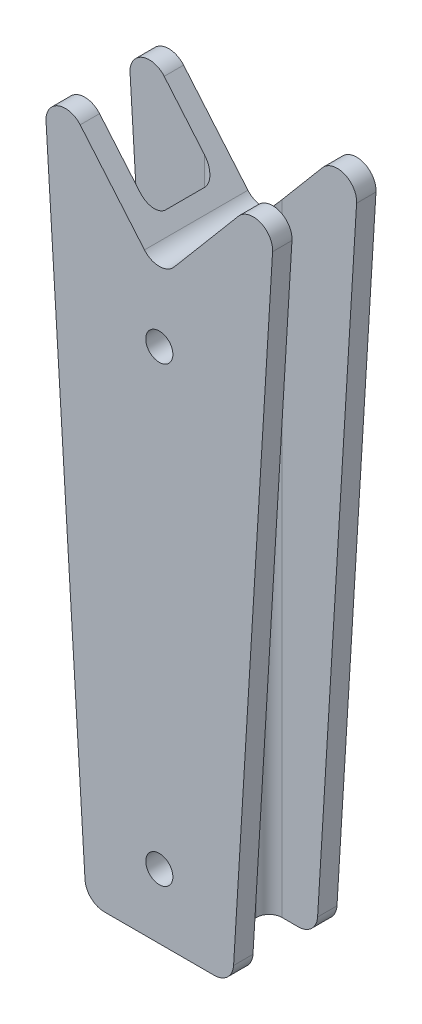
ISO-10303-21;
HEADER;
FILE_DESCRIPTION(('STEP AP214'),'2;1');
FILE_NAME('part.step','',(''),(''),'','','');
FILE_SCHEMA(('AUTOMOTIVE_DESIGN { 1 0 10303 214 1 1 1 1 }'));
ENDSEC;
DATA;
#1=APPLICATION_CONTEXT('core data for automotive mechanical design processes');
#2=APPLICATION_PROTOCOL_DEFINITION('international standard','automotive_design',2000,#1);
#3=PRODUCT_CONTEXT('',#1,'mechanical');
#4=PRODUCT('Part','Part','',(#3));
#5=PRODUCT_RELATED_PRODUCT_CATEGORY('part','',(#4));
#6=PRODUCT_DEFINITION_FORMATION('','',#4);
#7=PRODUCT_DEFINITION_CONTEXT('part definition',#1,'design');
#8=PRODUCT_DEFINITION('design','',#6,#7);
#9=PRODUCT_DEFINITION_SHAPE('','',#8);
#10=(LENGTH_UNIT() NAMED_UNIT(*) SI_UNIT(.MILLI.,.METRE.));
#11=(NAMED_UNIT(*) PLANE_ANGLE_UNIT() SI_UNIT($,.RADIAN.));
#12=(NAMED_UNIT(*) SI_UNIT($,.STERADIAN.) SOLID_ANGLE_UNIT());
#13=UNCERTAINTY_MEASURE_WITH_UNIT(LENGTH_MEASURE(1.E-05),#10,'distance_accuracy_value','');
#14=(GEOMETRIC_REPRESENTATION_CONTEXT(3) GLOBAL_UNCERTAINTY_ASSIGNED_CONTEXT((#13)) GLOBAL_UNIT_ASSIGNED_CONTEXT((#10,
#11,#12)) REPRESENTATION_CONTEXT('',''));
#15=CARTESIAN_POINT('',(0.,0.,0.));
#16=DIRECTION('',(0.,0.,1.));
#17=DIRECTION('',(1.,0.,0.));
#18=AXIS2_PLACEMENT_3D('',#15,#16,#17);
#19=CARTESIAN_POINT('',(8.49882971395205,-49.3339521277588,3.));
#20=DIRECTION('',(0.,0.,-1.));
#21=DIRECTION('',(-1.,0.,0.));
#22=AXIS2_PLACEMENT_3D('',#19,#20,#21);
#23=PLANE('',#22);
#24=DIRECTION('',(1.,0.,0.));
#25=VECTOR('',#24,1.);
#26=CARTESIAN_POINT('',(-8.49882971395178,-52.3339521277589,3.));
#27=LINE('',#26,#25);
#28=CARTESIAN_POINT('',(-8.49882971395178,-52.3339521277589,3.));
#29=VERTEX_POINT('',#28);
#30=CARTESIAN_POINT('',(-5.99999999999999,-52.3339521277589,3.));
#31=VERTEX_POINT('',#30);
#32=EDGE_CURVE('E276',#29,#31,#27,.T.);
#33=ORIENTED_EDGE('',*,*,#32,.T.);
#34=DIRECTION('',(0.,-1.,0.));
#35=VECTOR('',#34,1.);
#36=CARTESIAN_POINT('',(-5.99999999999999,41.5055641357911,3.));
#37=LINE('',#36,#35);
#38=CARTESIAN_POINT('',(-5.99999999999999,43.8750109484359,3.));
#39=VERTEX_POINT('',#38);
#40=EDGE_CURVE('E63',#31,#39,#37,.F.);
#41=ORIENTED_EDGE('',*,*,#40,.T.);
#42=DIRECTION('',(-0.645017731192304,0.764167603636488,0.));
#43=VECTOR('',#42,1.);
#44=CARTESIAN_POINT('',(-12.2411144520662,51.2690053213356,3.));
#45=LINE('',#44,#43);
#46=CARTESIAN_POINT('',(-12.2411144520662,51.2690053213356,3.));
#47=VERTEX_POINT('',#46);
#48=EDGE_CURVE('E267',#39,#47,#45,.T.);
#49=ORIENTED_EDGE('',*,*,#48,.T.);
#50=CARTESIAN_POINT('',(-14.5336172629757,49.3339521277588,3.));
#51=DIRECTION('',(0.,0.,1.));
#52=DIRECTION('',(1.,0.,0.));
#53=AXIS2_PLACEMENT_3D('',#50,#51,#52);
#54=CIRCLE('',#53,3.);
#55=CARTESIAN_POINT('',(-17.5280216582413,49.1508065091542,3.));
#56=VERTEX_POINT('',#55);
#57=EDGE_CURVE('E269',#47,#56,#54,.T.);
#58=ORIENTED_EDGE('',*,*,#57,.T.);
#59=DIRECTION('',(0.0610485395348503,-0.998134798421867,0.));
#60=VECTOR('',#59,1.);
#61=CARTESIAN_POINT('',(-17.5280216582413,49.1508065091542,3.));
#62=LINE('',#61,#60);
#63=CARTESIAN_POINT('',(-11.4932341092174,-49.5170977463634,3.));
#64=VERTEX_POINT('',#63);
#65=EDGE_CURVE('E271',#56,#64,#62,.T.);
#66=ORIENTED_EDGE('',*,*,#65,.T.);
#67=CARTESIAN_POINT('',(-8.49882971395181,-49.3339521277589,3.));
#68=DIRECTION('',(0.,0.,1.));
#69=DIRECTION('',(-1.,0.,0.));
#70=AXIS2_PLACEMENT_3D('',#67,#68,#69);
#71=CIRCLE('',#70,3.);
#72=EDGE_CURVE('E273',#64,#29,#71,.T.);
#73=ORIENTED_EDGE('',*,*,#72,.T.);
#74=EDGE_LOOP('',(#33,#41,#49,#58,#66,#73));
#75=FACE_BOUND('',#74,.T.);
#76=ADVANCED_FACE('F42',(#75),#23,.F.);
#77=DIRECTION('',(-0.645017731192302,-0.76416760363649,0.));
#78=VECTOR('',#77,1.);
#79=CARTESIAN_POINT('',(12.2411144520662,51.2690053213357,3.));
#80=LINE('',#79,#78);
#81=CARTESIAN_POINT('',(12.2411144520662,51.2690053213357,3.));
#82=VERTEX_POINT('',#81);
#83=CARTESIAN_POINT('',(5.99999999999999,43.8750109484359,3.));
#84=VERTEX_POINT('',#83);
#85=EDGE_CURVE('E264',#82,#84,#80,.T.);
#86=ORIENTED_EDGE('',*,*,#85,.T.);
#87=DIRECTION('',(0.,1.,0.));
#88=VECTOR('',#87,1.);
#89=CARTESIAN_POINT('',(6.00000000000001,-52.3339521277589,3.));
#90=LINE('',#89,#88);
#91=CARTESIAN_POINT('',(6.00000000000001,-52.3339521277589,3.));
#92=VERTEX_POINT('',#91);
#93=EDGE_CURVE('E332',#84,#92,#90,.F.);
#94=ORIENTED_EDGE('',*,*,#93,.T.);
#95=CARTESIAN_POINT('',(8.49882971395204,-52.3339521277588,3.));
#96=VERTEX_POINT('',#95);
#97=EDGE_CURVE('E275',#92,#96,#27,.T.);
#98=ORIENTED_EDGE('',*,*,#97,.T.);
#99=CARTESIAN_POINT('',(8.49882971395205,-49.3339521277588,3.));
#100=DIRECTION('',(0.,0.,1.));
#101=DIRECTION('',(-1.,0.,0.));
#102=AXIS2_PLACEMENT_3D('',#99,#100,#101);
#103=CIRCLE('',#102,3.);
#104=CARTESIAN_POINT('',(11.4932341092177,-49.5170977463634,3.));
#105=VERTEX_POINT('',#104);
#106=EDGE_CURVE('E256',#96,#105,#103,.T.);
#107=ORIENTED_EDGE('',*,*,#106,.T.);
#108=DIRECTION('',(0.0610485395348478,0.998134798421867,0.));
#109=VECTOR('',#108,1.);
#110=CARTESIAN_POINT('',(17.5280216582413,49.1508065091542,3.));
#111=LINE('',#110,#109);
#112=CARTESIAN_POINT('',(17.5280216582413,49.1508065091542,3.));
#113=VERTEX_POINT('',#112);
#114=EDGE_CURVE('E259',#105,#113,#111,.T.);
#115=ORIENTED_EDGE('',*,*,#114,.T.);
#116=CARTESIAN_POINT('',(14.5336172629757,49.3339521277589,3.));
#117=DIRECTION('',(0.,0.,1.));
#118=DIRECTION('',(1.,0.,0.));
#119=AXIS2_PLACEMENT_3D('',#116,#117,#118);
#120=CIRCLE('',#119,3.);
#121=EDGE_CURVE('E262',#113,#82,#120,.T.);
#122=ORIENTED_EDGE('',*,*,#121,.T.);
#123=EDGE_LOOP('',(#86,#94,#98,#107,#115,#122));
#124=FACE_BOUND('',#123,.T.);
#125=ADVANCED_FACE('F520',(#124),#23,.F.);
#126=CARTESIAN_POINT('',(8.49882971395205,-49.3339521277588,3.));
#127=DIRECTION('',(0.,0.,-1.));
#128=DIRECTION('',(-1.,0.,0.));
#129=AXIS2_PLACEMENT_3D('',#126,#127,#128);
#130=CYLINDRICAL_SURFACE('',#129,3.);
#131=CARTESIAN_POINT('',(8.49882971395205,-49.3339521277588,0.));
#132=DIRECTION('',(0.,0.,1.));
#133=DIRECTION('',(-1.,0.,0.));
#134=AXIS2_PLACEMENT_3D('',#131,#132,#133);
#135=CIRCLE('',#134,3.);
#136=CARTESIAN_POINT('',(8.49882971395204,-52.3339521277588,0.));
#137=VERTEX_POINT('',#136);
#138=CARTESIAN_POINT('',(11.4932341092177,-49.5170977463634,0.));
#139=VERTEX_POINT('',#138);
#140=EDGE_CURVE('E255',#137,#139,#135,.T.);
#141=ORIENTED_EDGE('',*,*,#140,.T.);
#142=DIRECTION('',(0.,0.,-1.));
#143=VECTOR('',#142,1.);
#144=CARTESIAN_POINT('',(11.4932341092177,-49.5170977463634,3.));
#145=LINE('',#144,#143);
#146=EDGE_CURVE('E324',#105,#139,#145,.T.);
#147=ORIENTED_EDGE('',*,*,#146,.F.);
#148=ORIENTED_EDGE('',*,*,#106,.F.);
#149=DIRECTION('',(0.,0.,-1.));
#150=VECTOR('',#149,1.);
#151=CARTESIAN_POINT('',(8.49882971395204,-52.3339521277588,3.));
#152=LINE('',#151,#150);
#153=EDGE_CURVE('E278',#96,#137,#152,.T.);
#154=ORIENTED_EDGE('',*,*,#153,.T.);
#155=EDGE_LOOP('',(#141,#147,#148,#154));
#156=FACE_BOUND('',#155,.T.);
#157=ADVANCED_FACE('F410',(#156),#130,.T.);
#158=CARTESIAN_POINT('',(17.5280216582413,49.1508065091542,3.));
#159=DIRECTION('',(-0.998134798421868,0.0610485395348478,0.));
#160=DIRECTION('',(-0.0610485395348478,-0.998134798421868,0.));
#161=AXIS2_PLACEMENT_3D('',#158,#159,#160);
#162=PLANE('',#161);
#163=DIRECTION('',(0.0610485395348478,0.998134798421867,0.));
#164=VECTOR('',#163,1.);
#165=CARTESIAN_POINT('',(17.5280216582413,49.1508065091542,0.));
#166=LINE('',#165,#164);
#167=CARTESIAN_POINT('',(17.5280216582413,49.1508065091542,0.));
#168=VERTEX_POINT('',#167);
#169=EDGE_CURVE('E281',#139,#168,#166,.T.);
#170=ORIENTED_EDGE('',*,*,#169,.T.);
#171=DIRECTION('',(0.,0.,-1.));
#172=VECTOR('',#171,1.);
#173=CARTESIAN_POINT('',(17.5280216582413,49.1508065091542,3.));
#174=LINE('',#173,#172);
#175=EDGE_CURVE('E321',#113,#168,#174,.T.);
#176=ORIENTED_EDGE('',*,*,#175,.F.);
#177=ORIENTED_EDGE('',*,*,#114,.F.);
#178=ORIENTED_EDGE('',*,*,#146,.T.);
#179=EDGE_LOOP('',(#170,#176,#177,#178));
#180=FACE_BOUND('',#179,.T.);
#181=ADVANCED_FACE('F519',(#180),#162,.F.);
#182=CARTESIAN_POINT('',(14.5336172629757,49.3339521277589,3.));
#183=DIRECTION('',(0.,0.,-1.));
#184=DIRECTION('',(-1.,0.,0.));
#185=AXIS2_PLACEMENT_3D('',#182,#183,#184);
#186=CYLINDRICAL_SURFACE('',#185,3.);
#187=CARTESIAN_POINT('',(14.5336172629757,49.3339521277589,0.));
#188=DIRECTION('',(0.,0.,1.));
#189=DIRECTION('',(1.,0.,0.));
#190=AXIS2_PLACEMENT_3D('',#187,#188,#189);
#191=CIRCLE('',#190,3.);
#192=CARTESIAN_POINT('',(12.2411144520662,51.2690053213357,0.));
#193=VERTEX_POINT('',#192);
#194=EDGE_CURVE('E283',#168,#193,#191,.T.);
#195=ORIENTED_EDGE('',*,*,#194,.T.);
#196=DIRECTION('',(0.,0.,-1.));
#197=VECTOR('',#196,1.);
#198=CARTESIAN_POINT('',(12.2411144520662,51.2690053213357,3.));
#199=LINE('',#198,#197);
#200=EDGE_CURVE('E318',#82,#193,#199,.T.);
#201=ORIENTED_EDGE('',*,*,#200,.F.);
#202=ORIENTED_EDGE('',*,*,#121,.F.);
#203=ORIENTED_EDGE('',*,*,#175,.T.);
#204=EDGE_LOOP('',(#195,#201,#202,#203));
#205=FACE_BOUND('',#204,.T.);
#206=ADVANCED_FACE('F516',(#205),#186,.T.);
#207=CARTESIAN_POINT('',(12.2411144520662,51.2690053213357,3.));
#208=DIRECTION('',(0.76416760363649,-0.645017731192302,0.));
#209=DIRECTION('',(0.645017731192302,0.76416760363649,0.));
#210=AXIS2_PLACEMENT_3D('',#207,#208,#209);
#211=PLANE('',#210);
#212=DIRECTION('',(-0.645017731192302,-0.76416760363649,0.));
#213=VECTOR('',#212,1.);
#214=CARTESIAN_POINT('',(12.2411144520662,51.2690053213357,0.));
#215=LINE('',#214,#213);
#216=CARTESIAN_POINT('',(2.2925028109095,39.4826522496458,0.));
#217=VERTEX_POINT('',#216);
#218=EDGE_CURVE('E285',#193,#217,#215,.T.);
#219=ORIENTED_EDGE('',*,*,#218,.T.);
#220=DIRECTION('',(0.,0.,-1.));
#221=VECTOR('',#220,1.);
#222=CARTESIAN_POINT('',(2.2925028109095,39.4826522496458,3.));
#223=LINE('',#222,#221);
#224=CARTESIAN_POINT('',(2.29250281090947,39.4826522496458,16.));
#225=VERTEX_POINT('',#224);
#226=EDGE_CURVE('E315',#225,#217,#223,.T.);
#227=ORIENTED_EDGE('',*,*,#226,.F.);
#228=DIRECTION('',(-0.645017731192302,-0.764167603636489,0.));
#229=VECTOR('',#228,1.);
#230=CARTESIAN_POINT('',(12.2411144520663,51.2690053213358,16.));
#231=LINE('',#230,#229);
#232=CARTESIAN_POINT('',(12.2411144520663,51.2690053213358,16.));
#233=VERTEX_POINT('',#232);
#234=EDGE_CURVE('E459',#233,#225,#231,.T.);
#235=ORIENTED_EDGE('',*,*,#234,.F.);
#236=DIRECTION('',(0.,0.,-1.));
#237=VECTOR('',#236,1.);
#238=CARTESIAN_POINT('',(12.2411144520663,51.2690053213358,16.));
#239=LINE('',#238,#237);
#240=CARTESIAN_POINT('',(12.2411144520663,51.2690053213358,13.));
#241=VERTEX_POINT('',#240);
#242=EDGE_CURVE('E243',#233,#241,#239,.T.);
#243=ORIENTED_EDGE('',*,*,#242,.T.);
#244=DIRECTION('',(-0.645017731192302,-0.764167603636489,0.));
#245=VECTOR('',#244,1.);
#246=CARTESIAN_POINT('',(12.2411144520663,51.2690053213358,13.));
#247=LINE('',#246,#245);
#248=CARTESIAN_POINT('',(5.99999999999999,43.8750109484359,13.));
#249=VERTEX_POINT('',#248);
#250=EDGE_CURVE('E375',#241,#249,#247,.T.);
#251=ORIENTED_EDGE('',*,*,#250,.T.);
#252=CARTESIAN_POINT('',(5.99999999999999,43.8750109484359,11.));
#253=DIRECTION('',(0.76416760363649,-0.645017731192302,0.));
#254=DIRECTION('',(0.645017731192302,0.76416760363649,0.));
#255=AXIS2_PLACEMENT_3D('',#252,#253,#254);
#256=ELLIPSE('',#255,3.1006899551475,2.);
#257=CARTESIAN_POINT('',(3.99999999999999,41.5055641357911,11.));
#258=VERTEX_POINT('',#257);
#259=EDGE_CURVE('E350',#249,#258,#256,.T.);
#260=ORIENTED_EDGE('',*,*,#259,.T.);
#261=DIRECTION('',(0.,0.,-1.));
#262=VECTOR('',#261,1.);
#263=CARTESIAN_POINT('',(3.99999999999999,41.5055641357911,13.));
#264=LINE('',#263,#262);
#265=CARTESIAN_POINT('',(3.99999999999999,41.5055641357911,5.));
#266=VERTEX_POINT('',#265);
#267=EDGE_CURVE('E249',#258,#266,#264,.T.);
#268=ORIENTED_EDGE('',*,*,#267,.T.);
#269=CARTESIAN_POINT('',(5.99999999999999,43.8750109484359,5.));
#270=DIRECTION('',(0.76416760363649,-0.645017731192302,0.));
#271=DIRECTION('',(-0.645017731192302,-0.76416760363649,0.));
#272=AXIS2_PLACEMENT_3D('',#269,#270,#271);
#273=ELLIPSE('',#272,3.1006899551475,2.);
#274=EDGE_CURVE('E346',#266,#84,#273,.T.);
#275=ORIENTED_EDGE('',*,*,#274,.T.);
#276=ORIENTED_EDGE('',*,*,#85,.F.);
#277=ORIENTED_EDGE('',*,*,#200,.T.);
#278=EDGE_LOOP('',(#219,#227,#235,#243,#251,#260,#268,#275,#276,#277));
#279=FACE_BOUND('',#278,.T.);
#280=ADVANCED_FACE('F425',(#279),#211,.F.);
#281=CARTESIAN_POINT('',(0.,41.4177054432227,3.));
#282=DIRECTION('',(0.,0.,-1.));
#283=DIRECTION('',(-1.,0.,0.));
#284=AXIS2_PLACEMENT_3D('',#281,#282,#283);
#285=CYLINDRICAL_SURFACE('',#284,3.);
#286=CARTESIAN_POINT('',(0.,41.4177054432227,0.));
#287=DIRECTION('',(0.,0.,-1.));
#288=DIRECTION('',(-1.,0.,0.));
#289=AXIS2_PLACEMENT_3D('',#286,#287,#288);
#290=CIRCLE('',#289,3.);
#291=CARTESIAN_POINT('',(-2.29250281090947,39.4826522496458,0.));
#292=VERTEX_POINT('',#291);
#293=EDGE_CURVE('E287',#217,#292,#290,.T.);
#294=ORIENTED_EDGE('',*,*,#293,.T.);
#295=DIRECTION('',(0.,0.,-1.));
#296=VECTOR('',#295,1.);
#297=CARTESIAN_POINT('',(-2.29250281090947,39.4826522496458,3.));
#298=LINE('',#297,#296);
#299=CARTESIAN_POINT('',(-2.29250281090944,39.4826522496458,16.));
#300=VERTEX_POINT('',#299);
#301=EDGE_CURVE('E312',#300,#292,#298,.T.);
#302=ORIENTED_EDGE('',*,*,#301,.F.);
#303=CARTESIAN_POINT('',(0.,41.4177054432227,16.));
#304=DIRECTION('',(0.,0.,-1.));
#305=DIRECTION('',(-1.,0.,0.));
#306=AXIS2_PLACEMENT_3D('',#303,#304,#305);
#307=CIRCLE('',#306,2.99999999999999);
#308=EDGE_CURVE('E499',#225,#300,#307,.T.);
#309=ORIENTED_EDGE('',*,*,#308,.F.);
#310=ORIENTED_EDGE('',*,*,#226,.T.);
#311=EDGE_LOOP('',(#294,#302,#309,#310));
#312=FACE_BOUND('',#311,.T.);
#313=ADVANCED_FACE('F512',(#312),#285,.F.);
#314=CARTESIAN_POINT('',(-12.2411144520662,51.2690053213356,3.));
#315=DIRECTION('',(-0.764167603636488,-0.645017731192304,0.));
#316=DIRECTION('',(0.645017731192304,-0.764167603636488,0.));
#317=AXIS2_PLACEMENT_3D('',#314,#315,#316);
#318=PLANE('',#317);
#319=DIRECTION('',(-0.645017731192304,0.764167603636488,0.));
#320=VECTOR('',#319,1.);
#321=CARTESIAN_POINT('',(-12.2411144520662,51.2690053213356,0.));
#322=LINE('',#321,#320);
#323=CARTESIAN_POINT('',(-12.2411144520662,51.2690053213356,0.));
#324=VERTEX_POINT('',#323);
#325=EDGE_CURVE('E289',#292,#324,#322,.T.);
#326=ORIENTED_EDGE('',*,*,#325,.T.);
#327=DIRECTION('',(0.,0.,-1.));
#328=VECTOR('',#327,1.);
#329=CARTESIAN_POINT('',(-12.2411144520662,51.2690053213356,3.));
#330=LINE('',#329,#328);
#331=EDGE_CURVE('E309',#47,#324,#330,.T.);
#332=ORIENTED_EDGE('',*,*,#331,.F.);
#333=ORIENTED_EDGE('',*,*,#48,.F.);
#334=CARTESIAN_POINT('',(-5.99999999999999,43.8750109484359,5.));
#335=DIRECTION('',(-0.764167603636488,-0.645017731192304,0.));
#336=DIRECTION('',(-0.645017731192304,0.764167603636488,0.));
#337=AXIS2_PLACEMENT_3D('',#334,#335,#336);
#338=ELLIPSE('',#337,3.10068995514749,2.);
#339=CARTESIAN_POINT('',(-3.99999999999999,41.5055641357911,5.));
#340=VERTEX_POINT('',#339);
#341=EDGE_CURVE('E11',#39,#340,#338,.T.);
#342=ORIENTED_EDGE('',*,*,#341,.T.);
#343=DIRECTION('',(0.,0.,-1.));
#344=VECTOR('',#343,1.);
#345=CARTESIAN_POINT('',(-3.99999999999999,41.5055641357911,13.));
#346=LINE('',#345,#344);
#347=CARTESIAN_POINT('',(-3.99999999999999,41.5055641357911,11.));
#348=VERTEX_POINT('',#347);
#349=EDGE_CURVE('E241',#348,#340,#346,.T.);
#350=ORIENTED_EDGE('',*,*,#349,.F.);
#351=CARTESIAN_POINT('',(-5.99999999999999,43.8750109484359,11.));
#352=DIRECTION('',(-0.764167603636488,-0.645017731192304,0.));
#353=DIRECTION('',(0.645017731192304,-0.764167603636488,0.));
#354=AXIS2_PLACEMENT_3D('',#351,#352,#353);
#355=ELLIPSE('',#354,3.10068995514749,2.);
#356=CARTESIAN_POINT('',(-5.99999999999999,43.8750109484359,13.));
#357=VERTEX_POINT('',#356);
#358=EDGE_CURVE('E356',#348,#357,#355,.T.);
#359=ORIENTED_EDGE('',*,*,#358,.T.);
#360=DIRECTION('',(-0.645017731192305,0.764167603636487,0.));
#361=VECTOR('',#360,1.);
#362=CARTESIAN_POINT('',(-12.2411144520663,51.2690053213357,13.));
#363=LINE('',#362,#361);
#364=CARTESIAN_POINT('',(-12.2411144520663,51.2690053213357,13.));
#365=VERTEX_POINT('',#364);
#366=EDGE_CURVE('E363',#357,#365,#363,.T.);
#367=ORIENTED_EDGE('',*,*,#366,.T.);
#368=DIRECTION('',(0.,0.,-1.));
#369=VECTOR('',#368,1.);
#370=CARTESIAN_POINT('',(-12.2411144520663,51.2690053213357,16.));
#371=LINE('',#370,#369);
#372=CARTESIAN_POINT('',(-12.2411144520663,51.2690053213357,16.));
#373=VERTEX_POINT('',#372);
#374=EDGE_CURVE('E455',#373,#365,#371,.T.);
#375=ORIENTED_EDGE('',*,*,#374,.F.);
#376=DIRECTION('',(-0.645017731192305,0.764167603636487,0.));
#377=VECTOR('',#376,1.);
#378=CARTESIAN_POINT('',(-12.2411144520663,51.2690053213357,16.));
#379=LINE('',#378,#377);
#380=EDGE_CURVE('E502',#300,#373,#379,.T.);
#381=ORIENTED_EDGE('',*,*,#380,.F.);
#382=ORIENTED_EDGE('',*,*,#301,.T.);
#383=EDGE_LOOP('',(#326,#332,#333,#342,#350,#359,#367,#375,#381,#382));
#384=FACE_BOUND('',#383,.T.);
#385=ADVANCED_FACE('F361',(#384),#318,.F.);
#386=CARTESIAN_POINT('',(-14.5336172629757,49.3339521277588,3.));
#387=DIRECTION('',(0.,0.,-1.));
#388=DIRECTION('',(-1.,0.,0.));
#389=AXIS2_PLACEMENT_3D('',#386,#387,#388);
#390=CYLINDRICAL_SURFACE('',#389,3.);
#391=CARTESIAN_POINT('',(-14.5336172629757,49.3339521277588,0.));
#392=DIRECTION('',(0.,0.,1.));
#393=DIRECTION('',(1.,0.,0.));
#394=AXIS2_PLACEMENT_3D('',#391,#392,#393);
#395=CIRCLE('',#394,3.);
#396=CARTESIAN_POINT('',(-17.5280216582413,49.1508065091542,0.));
#397=VERTEX_POINT('',#396);
#398=EDGE_CURVE('E291',#324,#397,#395,.T.);
#399=ORIENTED_EDGE('',*,*,#398,.T.);
#400=DIRECTION('',(0.,0.,-1.));
#401=VECTOR('',#400,1.);
#402=CARTESIAN_POINT('',(-17.5280216582413,49.1508065091542,3.));
#403=LINE('',#402,#401);
#404=EDGE_CURVE('E306',#56,#397,#403,.T.);
#405=ORIENTED_EDGE('',*,*,#404,.F.);
#406=ORIENTED_EDGE('',*,*,#57,.F.);
#407=ORIENTED_EDGE('',*,*,#331,.T.);
#408=EDGE_LOOP('',(#399,#405,#406,#407));
#409=FACE_BOUND('',#408,.T.);
#410=ADVANCED_FACE('F392',(#409),#390,.T.);
#411=CARTESIAN_POINT('',(-17.5280216582413,49.1508065091542,3.));
#412=DIRECTION('',(0.998134798421867,0.0610485395348503,0.));
#413=DIRECTION('',(-0.0610485395348503,0.998134798421867,0.));
#414=AXIS2_PLACEMENT_3D('',#411,#412,#413);
#415=PLANE('',#414);
#416=DIRECTION('',(0.0610485395348503,-0.998134798421867,0.));
#417=VECTOR('',#416,1.);
#418=CARTESIAN_POINT('',(-17.5280216582413,49.1508065091542,0.));
#419=LINE('',#418,#417);
#420=CARTESIAN_POINT('',(-11.4932341092174,-49.5170977463634,0.));
#421=VERTEX_POINT('',#420);
#422=EDGE_CURVE('E293',#397,#421,#419,.T.);
#423=ORIENTED_EDGE('',*,*,#422,.T.);
#424=DIRECTION('',(0.,0.,-1.));
#425=VECTOR('',#424,1.);
#426=CARTESIAN_POINT('',(-11.4932341092174,-49.5170977463634,3.));
#427=LINE('',#426,#425);
#428=EDGE_CURVE('E303',#64,#421,#427,.T.);
#429=ORIENTED_EDGE('',*,*,#428,.F.);
#430=ORIENTED_EDGE('',*,*,#65,.F.);
#431=ORIENTED_EDGE('',*,*,#404,.T.);
#432=EDGE_LOOP('',(#423,#429,#430,#431));
#433=FACE_BOUND('',#432,.T.);
#434=ADVANCED_FACE('F396',(#433),#415,.F.);
#435=CARTESIAN_POINT('',(-8.49882971395181,-49.3339521277589,3.));
#436=DIRECTION('',(0.,0.,-1.));
#437=DIRECTION('',(-1.,0.,0.));
#438=AXIS2_PLACEMENT_3D('',#435,#436,#437);
#439=CYLINDRICAL_SURFACE('',#438,3.);
#440=CARTESIAN_POINT('',(-8.49882971395181,-49.3339521277589,0.));
#441=DIRECTION('',(0.,0.,1.));
#442=DIRECTION('',(-1.,0.,0.));
#443=AXIS2_PLACEMENT_3D('',#440,#441,#442);
#444=CIRCLE('',#443,3.);
#445=CARTESIAN_POINT('',(-8.49882971395178,-52.3339521277589,0.));
#446=VERTEX_POINT('',#445);
#447=EDGE_CURVE('E295',#421,#446,#444,.T.);
#448=ORIENTED_EDGE('',*,*,#447,.T.);
#449=DIRECTION('',(0.,0.,-1.));
#450=VECTOR('',#449,1.);
#451=CARTESIAN_POINT('',(-8.49882971395178,-52.3339521277589,3.));
#452=LINE('',#451,#450);
#453=EDGE_CURVE('E300',#29,#446,#452,.T.);
#454=ORIENTED_EDGE('',*,*,#453,.F.);
#455=ORIENTED_EDGE('',*,*,#72,.F.);
#456=ORIENTED_EDGE('',*,*,#428,.T.);
#457=EDGE_LOOP('',(#448,#454,#455,#456));
#458=FACE_BOUND('',#457,.T.);
#459=ADVANCED_FACE('F401',(#458),#439,.T.);
#460=CARTESIAN_POINT('',(-8.49882971395178,-52.3339521277589,3.));
#461=DIRECTION('',(0.,1.,0.));
#462=DIRECTION('',(-1.,0.,0.));
#463=AXIS2_PLACEMENT_3D('',#460,#461,#462);
#464=PLANE('',#463);
#465=DIRECTION('',(1.,0.,0.));
#466=VECTOR('',#465,1.);
#467=CARTESIAN_POINT('',(-8.49882971395178,-52.3339521277589,0.));
#468=LINE('',#467,#466);
#469=EDGE_CURVE('E260',#446,#137,#468,.T.);
#470=ORIENTED_EDGE('',*,*,#469,.T.);
#471=ORIENTED_EDGE('',*,*,#153,.F.);
#472=ORIENTED_EDGE('',*,*,#97,.F.);
#473=CARTESIAN_POINT('',(6.00000000000001,-52.3339521277589,5.));
#474=DIRECTION('',(0.,1.,0.));
#475=DIRECTION('',(-1.,0.,0.));
#476=AXIS2_PLACEMENT_3D('',#473,#474,#475);
#477=CIRCLE('',#476,2.);
#478=CARTESIAN_POINT('',(4.00000000000001,-52.3339521277589,5.));
#479=VERTEX_POINT('',#478);
#480=EDGE_CURVE('E348',#92,#479,#477,.T.);
#481=ORIENTED_EDGE('',*,*,#480,.T.);
#482=DIRECTION('',(0.,0.,-1.));
#483=VECTOR('',#482,1.);
#484=CARTESIAN_POINT('',(4.00000000000001,-52.3339521277589,13.));
#485=LINE('',#484,#483);
#486=CARTESIAN_POINT('',(4.00000000000001,-52.3339521277589,11.));
#487=VERTEX_POINT('',#486);
#488=EDGE_CURVE('E252',#487,#479,#485,.T.);
#489=ORIENTED_EDGE('',*,*,#488,.F.);
#490=CARTESIAN_POINT('',(6.00000000000001,-52.3339521277589,11.));
#491=DIRECTION('',(0.,1.,0.));
#492=DIRECTION('',(-1.,0.,0.));
#493=AXIS2_PLACEMENT_3D('',#490,#491,#492);
#494=CIRCLE('',#493,2.);
#495=CARTESIAN_POINT('',(6.00000000000001,-52.3339521277589,13.));
#496=VERTEX_POINT('',#495);
#497=EDGE_CURVE('E352',#487,#496,#494,.T.);
#498=ORIENTED_EDGE('',*,*,#497,.T.);
#499=DIRECTION('',(1.,0.,0.));
#500=VECTOR('',#499,1.);
#501=CARTESIAN_POINT('',(-8.49882971395181,-52.3339521277589,13.));
#502=LINE('',#501,#500);
#503=CARTESIAN_POINT('',(8.49882971395206,-52.3339521277589,13.));
#504=VERTEX_POINT('',#503);
#505=EDGE_CURVE('E438',#496,#504,#502,.T.);
#506=ORIENTED_EDGE('',*,*,#505,.T.);
#507=DIRECTION('',(0.,0.,-1.));
#508=VECTOR('',#507,1.);
#509=CARTESIAN_POINT('',(8.49882971395206,-52.3339521277589,16.));
#510=LINE('',#509,#508);
#511=CARTESIAN_POINT('',(8.49882971395206,-52.3339521277589,16.));
#512=VERTEX_POINT('',#511);
#513=EDGE_CURVE('E445',#512,#504,#510,.T.);
#514=ORIENTED_EDGE('',*,*,#513,.F.);
#515=DIRECTION('',(1.,0.,0.));
#516=VECTOR('',#515,1.);
#517=CARTESIAN_POINT('',(-8.49882971395181,-52.3339521277589,16.));
#518=LINE('',#517,#516);
#519=CARTESIAN_POINT('',(-8.49882971395181,-52.3339521277589,16.));
#520=VERTEX_POINT('',#519);
#521=EDGE_CURVE('E230',#520,#512,#518,.T.);
#522=ORIENTED_EDGE('',*,*,#521,.F.);
#523=DIRECTION('',(0.,0.,-1.));
#524=VECTOR('',#523,1.);
#525=CARTESIAN_POINT('',(-8.49882971395181,-52.3339521277589,16.));
#526=LINE('',#525,#524);
#527=CARTESIAN_POINT('',(-8.49882971395181,-52.3339521277589,13.));
#528=VERTEX_POINT('',#527);
#529=EDGE_CURVE('E447',#520,#528,#526,.T.);
#530=ORIENTED_EDGE('',*,*,#529,.T.);
#531=CARTESIAN_POINT('',(-5.99999999999999,-52.3339521277589,13.));
#532=VERTEX_POINT('',#531);
#533=EDGE_CURVE('E234',#528,#532,#502,.T.);
#534=ORIENTED_EDGE('',*,*,#533,.T.);
#535=CARTESIAN_POINT('',(-5.99999999999999,-52.3339521277589,11.));
#536=DIRECTION('',(0.,1.,0.));
#537=DIRECTION('',(-1.,0.,0.));
#538=AXIS2_PLACEMENT_3D('',#535,#536,#537);
#539=CIRCLE('',#538,2.);
#540=CARTESIAN_POINT('',(-3.99999999999999,-52.3339521277589,11.));
#541=VERTEX_POINT('',#540);
#542=EDGE_CURVE('E354',#532,#541,#539,.T.);
#543=ORIENTED_EDGE('',*,*,#542,.T.);
#544=DIRECTION('',(0.,0.,-1.));
#545=VECTOR('',#544,1.);
#546=CARTESIAN_POINT('',(-3.99999999999999,-52.3339521277589,13.));
#547=LINE('',#546,#545);
#548=CARTESIAN_POINT('',(-3.99999999999999,-52.3339521277589,5.));
#549=VERTEX_POINT('',#548);
#550=EDGE_CURVE('E239',#541,#549,#547,.T.);
#551=ORIENTED_EDGE('',*,*,#550,.T.);
#552=CARTESIAN_POINT('',(-5.99999999999999,-52.3339521277589,5.));
#553=DIRECTION('',(0.,1.,0.));
#554=DIRECTION('',(-1.,0.,0.));
#555=AXIS2_PLACEMENT_3D('',#552,#553,#554);
#556=CIRCLE('',#555,2.);
#557=EDGE_CURVE('E50',#549,#31,#556,.T.);
#558=ORIENTED_EDGE('',*,*,#557,.T.);
#559=ORIENTED_EDGE('',*,*,#32,.F.);
#560=ORIENTED_EDGE('',*,*,#453,.T.);
#561=EDGE_LOOP('',(#470,#471,#472,#481,#489,#498,#506,#514,#522,#530,#534,#543,#551,#558,#559,#560));
#562=FACE_BOUND('',#561,.T.);
#563=ADVANCED_FACE('F379',(#562),#464,.F.);
#564=CARTESIAN_POINT('',(8.49882971395205,-49.3339521277588,0.));
#565=DIRECTION('',(0.,0.,-1.));
#566=DIRECTION('',(-1.,0.,0.));
#567=AXIS2_PLACEMENT_3D('',#564,#565,#566);
#568=PLANE('',#567);
#569=CARTESIAN_POINT('',(0.,-42.3339521277589,0.));
#570=DIRECTION('',(0.,0.,-1.));
#571=DIRECTION('',(-1.,0.,0.));
#572=AXIS2_PLACEMENT_3D('',#569,#570,#571);
#573=CIRCLE('',#572,2.1);
#574=CARTESIAN_POINT('',(-2.09999999999999,-42.3339521277589,0.));
#575=VERTEX_POINT('',#574);
#576=EDGE_CURVE('E486',#575,#575,#573,.T.);
#577=ORIENTED_EDGE('',*,*,#576,.F.);
#578=EDGE_LOOP('',(#577));
#579=FACE_BOUND('',#578,.T.);
#580=CARTESIAN_POINT('',(0.,27.6660478722411,0.));
#581=DIRECTION('',(0.,0.,-1.));
#582=DIRECTION('',(-1.,0.,0.));
#583=AXIS2_PLACEMENT_3D('',#580,#581,#582);
#584=CIRCLE('',#583,2.1);
#585=CARTESIAN_POINT('',(-2.1,27.6660478722411,0.));
#586=VERTEX_POINT('',#585);
#587=EDGE_CURVE('E488',#586,#586,#584,.T.);
#588=ORIENTED_EDGE('',*,*,#587,.F.);
#589=EDGE_LOOP('',(#588));
#590=FACE_BOUND('',#589,.T.);
#591=ORIENTED_EDGE('',*,*,#140,.F.);
#592=ORIENTED_EDGE('',*,*,#469,.F.);
#593=ORIENTED_EDGE('',*,*,#447,.F.);
#594=ORIENTED_EDGE('',*,*,#422,.F.);
#595=ORIENTED_EDGE('',*,*,#398,.F.);
#596=ORIENTED_EDGE('',*,*,#325,.F.);
#597=ORIENTED_EDGE('',*,*,#293,.F.);
#598=ORIENTED_EDGE('',*,*,#218,.F.);
#599=ORIENTED_EDGE('',*,*,#194,.F.);
#600=ORIENTED_EDGE('',*,*,#169,.F.);
#601=EDGE_LOOP('',(#591,#592,#593,#594,#595,#596,#597,#598,#599,#600));
#602=FACE_BOUND('',#601,.T.);
#603=ADVANCED_FACE('F406',(#579,#590,#602),#568,.T.);
#604=CARTESIAN_POINT('',(4.00000000000001,-52.3339521277589,13.));
#605=DIRECTION('',(-1.,0.,0.));
#606=DIRECTION('',(0.,-1.,0.));
#607=AXIS2_PLACEMENT_3D('',#604,#605,#606);
#608=PLANE('',#607);
#609=ORIENTED_EDGE('',*,*,#488,.T.);
#610=DIRECTION('',(0.,1.,0.));
#611=VECTOR('',#610,1.);
#612=CARTESIAN_POINT('',(3.99999999999999,41.5055641357911,5.));
#613=LINE('',#612,#611);
#614=EDGE_CURVE('E329',#479,#266,#613,.T.);
#615=ORIENTED_EDGE('',*,*,#614,.T.);
#616=ORIENTED_EDGE('',*,*,#267,.F.);
#617=DIRECTION('',(0.,1.,0.));
#618=VECTOR('',#617,1.);
#619=CARTESIAN_POINT('',(4.00000000000001,-52.3339521277589,11.));
#620=LINE('',#619,#618);
#621=EDGE_CURVE('E327',#258,#487,#620,.F.);
#622=ORIENTED_EDGE('',*,*,#621,.T.);
#623=EDGE_LOOP('',(#609,#615,#616,#622));
#624=FACE_BOUND('',#623,.T.);
#625=ADVANCED_FACE('F422',(#624),#608,.F.);
#626=CARTESIAN_POINT('',(-3.99999999999999,-52.3339521277589,13.));
#627=DIRECTION('',(1.,0.,0.));
#628=DIRECTION('',(0.,0.,-1.));
#629=AXIS2_PLACEMENT_3D('',#626,#627,#628);
#630=PLANE('',#629);
#631=ORIENTED_EDGE('',*,*,#550,.F.);
#632=DIRECTION('',(0.,-1.,0.));
#633=VECTOR('',#632,1.);
#634=CARTESIAN_POINT('',(-3.99999999999999,-52.3339521277589,11.));
#635=LINE('',#634,#633);
#636=EDGE_CURVE('E343',#541,#348,#635,.F.);
#637=ORIENTED_EDGE('',*,*,#636,.T.);
#638=ORIENTED_EDGE('',*,*,#349,.T.);
#639=DIRECTION('',(0.,-1.,0.));
#640=VECTOR('',#639,1.);
#641=CARTESIAN_POINT('',(-3.99999999999999,-52.3339521277589,5.));
#642=LINE('',#641,#640);
#643=EDGE_CURVE('E340',#340,#549,#642,.T.);
#644=ORIENTED_EDGE('',*,*,#643,.T.);
#645=EDGE_LOOP('',(#631,#637,#638,#644));
#646=FACE_BOUND('',#645,.T.);
#647=ADVANCED_FACE('F382',(#646),#630,.F.);
#648=CARTESIAN_POINT('',(8.49882971395207,-49.3339521277589,13.));
#649=DIRECTION('',(0.,0.,-1.));
#650=DIRECTION('',(-1.,0.,0.));
#651=AXIS2_PLACEMENT_3D('',#648,#649,#650);
#652=PLANE('',#651);
#653=ORIENTED_EDGE('',*,*,#505,.F.);
#654=DIRECTION('',(0.,1.,0.));
#655=VECTOR('',#654,1.);
#656=CARTESIAN_POINT('',(6.00000000000001,-49.3339521277589,13.));
#657=LINE('',#656,#655);
#658=EDGE_CURVE('E334',#496,#249,#657,.T.);
#659=ORIENTED_EDGE('',*,*,#658,.T.);
#660=ORIENTED_EDGE('',*,*,#250,.F.);
#661=CARTESIAN_POINT('',(14.5336172629757,49.3339521277589,13.));
#662=DIRECTION('',(0.,0.,1.));
#663=DIRECTION('',(1.,0.,0.));
#664=AXIS2_PLACEMENT_3D('',#661,#662,#663);
#665=CIRCLE('',#664,2.99999999999999);
#666=CARTESIAN_POINT('',(17.5280216582413,49.1508065091544,13.));
#667=VERTEX_POINT('',#666);
#668=EDGE_CURVE('E462',#667,#241,#665,.T.);
#669=ORIENTED_EDGE('',*,*,#668,.F.);
#670=DIRECTION('',(0.0610485395348476,0.998134798421867,0.));
#671=VECTOR('',#670,1.);
#672=CARTESIAN_POINT('',(17.5280216582413,49.1508065091544,13.));
#673=LINE('',#672,#671);
#674=CARTESIAN_POINT('',(11.4932341092177,-49.5170977463634,13.));
#675=VERTEX_POINT('',#674);
#676=EDGE_CURVE('E463',#675,#667,#673,.T.);
#677=ORIENTED_EDGE('',*,*,#676,.F.);
#678=CARTESIAN_POINT('',(8.49882971395207,-49.3339521277589,13.));
#679=DIRECTION('',(0.,0.,1.));
#680=DIRECTION('',(-1.,0.,0.));
#681=AXIS2_PLACEMENT_3D('',#678,#679,#680);
#682=CIRCLE('',#681,3.);
#683=EDGE_CURVE('E238',#504,#675,#682,.T.);
#684=ORIENTED_EDGE('',*,*,#683,.F.);
#685=EDGE_LOOP('',(#653,#659,#660,#669,#677,#684));
#686=FACE_BOUND('',#685,.T.);
#687=ADVANCED_FACE('F436',(#686),#652,.T.);
#688=CARTESIAN_POINT('',(8.49882971395207,-49.3339521277589,16.));
#689=DIRECTION('',(0.,0.,-1.));
#690=DIRECTION('',(-1.,0.,0.));
#691=AXIS2_PLACEMENT_3D('',#688,#689,#690);
#692=CYLINDRICAL_SURFACE('',#691,3.);
#693=ORIENTED_EDGE('',*,*,#683,.T.);
#694=DIRECTION('',(0.,0.,-1.));
#695=VECTOR('',#694,1.);
#696=CARTESIAN_POINT('',(11.4932341092177,-49.5170977463634,16.));
#697=LINE('',#696,#695);
#698=CARTESIAN_POINT('',(11.4932341092177,-49.5170977463634,16.));
#699=VERTEX_POINT('',#698);
#700=EDGE_CURVE('E218',#699,#675,#697,.T.);
#701=ORIENTED_EDGE('',*,*,#700,.F.);
#702=CARTESIAN_POINT('',(8.49882971395207,-49.3339521277589,16.));
#703=DIRECTION('',(0.,0.,1.));
#704=DIRECTION('',(-1.,0.,0.));
#705=AXIS2_PLACEMENT_3D('',#702,#703,#704);
#706=CIRCLE('',#705,3.);
#707=EDGE_CURVE('E225',#512,#699,#706,.T.);
#708=ORIENTED_EDGE('',*,*,#707,.F.);
#709=ORIENTED_EDGE('',*,*,#513,.T.);
#710=EDGE_LOOP('',(#693,#701,#708,#709));
#711=FACE_BOUND('',#710,.T.);
#712=ADVANCED_FACE('F236',(#711),#692,.T.);
#713=CARTESIAN_POINT('',(17.5280216582413,49.1508065091544,16.));
#714=DIRECTION('',(-0.998134798421868,0.0610485395348476,0.));
#715=DIRECTION('',(-0.0610485395348476,-0.998134798421868,0.));
#716=AXIS2_PLACEMENT_3D('',#713,#714,#715);
#717=PLANE('',#716);
#718=ORIENTED_EDGE('',*,*,#676,.T.);
#719=DIRECTION('',(0.,0.,-1.));
#720=VECTOR('',#719,1.);
#721=CARTESIAN_POINT('',(17.5280216582413,49.1508065091544,16.));
#722=LINE('',#721,#720);
#723=CARTESIAN_POINT('',(17.5280216582413,49.1508065091544,16.));
#724=VERTEX_POINT('',#723);
#725=EDGE_CURVE('E221',#724,#667,#722,.T.);
#726=ORIENTED_EDGE('',*,*,#725,.F.);
#727=DIRECTION('',(0.0610485395348476,0.998134798421867,0.));
#728=VECTOR('',#727,1.);
#729=CARTESIAN_POINT('',(17.5280216582413,49.1508065091544,16.));
#730=LINE('',#729,#728);
#731=EDGE_CURVE('E214',#699,#724,#730,.T.);
#732=ORIENTED_EDGE('',*,*,#731,.F.);
#733=ORIENTED_EDGE('',*,*,#700,.T.);
#734=EDGE_LOOP('',(#718,#726,#732,#733));
#735=FACE_BOUND('',#734,.T.);
#736=ADVANCED_FACE('F216',(#735),#717,.F.);
#737=CARTESIAN_POINT('',(14.5336172629757,49.3339521277589,16.));
#738=DIRECTION('',(0.,0.,-1.));
#739=DIRECTION('',(-1.,0.,0.));
#740=AXIS2_PLACEMENT_3D('',#737,#738,#739);
#741=CYLINDRICAL_SURFACE('',#740,2.99999999999999);
#742=ORIENTED_EDGE('',*,*,#668,.T.);
#743=ORIENTED_EDGE('',*,*,#242,.F.);
#744=CARTESIAN_POINT('',(14.5336172629757,49.3339521277589,16.));
#745=DIRECTION('',(0.,0.,1.));
#746=DIRECTION('',(1.,0.,0.));
#747=AXIS2_PLACEMENT_3D('',#744,#745,#746);
#748=CIRCLE('',#747,2.99999999999999);
#749=EDGE_CURVE('E224',#724,#233,#748,.T.);
#750=ORIENTED_EDGE('',*,*,#749,.F.);
#751=ORIENTED_EDGE('',*,*,#725,.T.);
#752=EDGE_LOOP('',(#742,#743,#750,#751));
#753=FACE_BOUND('',#752,.T.);
#754=ADVANCED_FACE('F461',(#753),#741,.T.);
#755=CARTESIAN_POINT('',(-14.5336172629757,49.3339521277588,16.));
#756=DIRECTION('',(0.,0.,-1.));
#757=DIRECTION('',(-1.,0.,0.));
#758=AXIS2_PLACEMENT_3D('',#755,#756,#757);
#759=CYLINDRICAL_SURFACE('',#758,3.);
#760=CARTESIAN_POINT('',(-14.5336172629757,49.3339521277588,13.));
#761=DIRECTION('',(0.,0.,1.));
#762=DIRECTION('',(1.,0.,0.));
#763=AXIS2_PLACEMENT_3D('',#760,#761,#762);
#764=CIRCLE('',#763,3.);
#765=CARTESIAN_POINT('',(-17.5280216582413,49.1508065091543,13.));
#766=VERTEX_POINT('',#765);
#767=EDGE_CURVE('E374',#365,#766,#764,.T.);
#768=ORIENTED_EDGE('',*,*,#767,.T.);
#769=DIRECTION('',(0.,0.,-1.));
#770=VECTOR('',#769,1.);
#771=CARTESIAN_POINT('',(-17.5280216582413,49.1508065091543,16.));
#772=LINE('',#771,#770);
#773=CARTESIAN_POINT('',(-17.5280216582413,49.1508065091543,16.));
#774=VERTEX_POINT('',#773);
#775=EDGE_CURVE('E452',#774,#766,#772,.T.);
#776=ORIENTED_EDGE('',*,*,#775,.F.);
#777=CARTESIAN_POINT('',(-14.5336172629757,49.3339521277588,16.));
#778=DIRECTION('',(0.,0.,1.));
#779=DIRECTION('',(1.,0.,0.));
#780=AXIS2_PLACEMENT_3D('',#777,#778,#779);
#781=CIRCLE('',#780,3.);
#782=EDGE_CURVE('E483',#373,#774,#781,.T.);
#783=ORIENTED_EDGE('',*,*,#782,.F.);
#784=ORIENTED_EDGE('',*,*,#374,.T.);
#785=EDGE_LOOP('',(#768,#776,#783,#784));
#786=FACE_BOUND('',#785,.T.);
#787=ADVANCED_FACE('F506',(#786),#759,.T.);
#788=CARTESIAN_POINT('',(-17.5280216582413,49.1508065091543,16.));
#789=DIRECTION('',(0.998134798421867,0.0610485395348503,0.));
#790=DIRECTION('',(-0.0610485395348503,0.998134798421867,0.));
#791=AXIS2_PLACEMENT_3D('',#788,#789,#790);
#792=PLANE('',#791);
#793=DIRECTION('',(0.0610485395348503,-0.998134798421867,0.));
#794=VECTOR('',#793,1.);
#795=CARTESIAN_POINT('',(-17.5280216582413,49.1508065091543,13.));
#796=LINE('',#795,#794);
#797=CARTESIAN_POINT('',(-11.4932341092174,-49.5170977463634,13.));
#798=VERTEX_POINT('',#797);
#799=EDGE_CURVE('E441',#766,#798,#796,.T.);
#800=ORIENTED_EDGE('',*,*,#799,.T.);
#801=DIRECTION('',(0.,0.,-1.));
#802=VECTOR('',#801,1.);
#803=CARTESIAN_POINT('',(-11.4932341092174,-49.5170977463634,16.));
#804=LINE('',#803,#802);
#805=CARTESIAN_POINT('',(-11.4932341092174,-49.5170977463634,16.));
#806=VERTEX_POINT('',#805);
#807=EDGE_CURVE('E449',#806,#798,#804,.T.);
#808=ORIENTED_EDGE('',*,*,#807,.F.);
#809=DIRECTION('',(0.0610485395348503,-0.998134798421867,0.));
#810=VECTOR('',#809,1.);
#811=CARTESIAN_POINT('',(-17.5280216582413,49.1508065091543,16.));
#812=LINE('',#811,#810);
#813=EDGE_CURVE('E480',#774,#806,#812,.T.);
#814=ORIENTED_EDGE('',*,*,#813,.F.);
#815=ORIENTED_EDGE('',*,*,#775,.T.);
#816=EDGE_LOOP('',(#800,#808,#814,#815));
#817=FACE_BOUND('',#816,.T.);
#818=ADVANCED_FACE('F471',(#817),#792,.F.);
#819=CARTESIAN_POINT('',(-8.49882971395181,-49.3339521277589,16.));
#820=DIRECTION('',(0.,0.,-1.));
#821=DIRECTION('',(-1.,0.,0.));
#822=AXIS2_PLACEMENT_3D('',#819,#820,#821);
#823=CYLINDRICAL_SURFACE('',#822,3.);
#824=CARTESIAN_POINT('',(-8.49882971395181,-49.3339521277589,13.));
#825=DIRECTION('',(0.,0.,1.));
#826=DIRECTION('',(-1.,0.,0.));
#827=AXIS2_PLACEMENT_3D('',#824,#825,#826);
#828=CIRCLE('',#827,3.);
#829=EDGE_CURVE('E439',#798,#528,#828,.T.);
#830=ORIENTED_EDGE('',*,*,#829,.T.);
#831=ORIENTED_EDGE('',*,*,#529,.F.);
#832=CARTESIAN_POINT('',(-8.49882971395181,-49.3339521277589,16.));
#833=DIRECTION('',(0.,0.,1.));
#834=DIRECTION('',(-1.,0.,0.));
#835=AXIS2_PLACEMENT_3D('',#832,#833,#834);
#836=CIRCLE('',#835,3.);
#837=EDGE_CURVE('E479',#806,#520,#836,.T.);
#838=ORIENTED_EDGE('',*,*,#837,.F.);
#839=ORIENTED_EDGE('',*,*,#807,.T.);
#840=EDGE_LOOP('',(#830,#831,#838,#839));
#841=FACE_BOUND('',#840,.T.);
#842=ADVANCED_FACE('F477',(#841),#823,.T.);
#843=CARTESIAN_POINT('',(8.49882971395207,-49.3339521277589,16.));
#844=DIRECTION('',(0.,0.,-1.));
#845=DIRECTION('',(-1.,0.,0.));
#846=AXIS2_PLACEMENT_3D('',#843,#844,#845);
#847=PLANE('',#846);
#848=CARTESIAN_POINT('',(0.,-42.3339521277589,16.));
#849=DIRECTION('',(0.,0.,1.));
#850=DIRECTION('',(1.,0.,0.));
#851=AXIS2_PLACEMENT_3D('',#848,#849,#850);
#852=CIRCLE('',#851,2.1);
#853=CARTESIAN_POINT('',(2.10000000000001,-42.3339521277589,16.));
#854=VERTEX_POINT('',#853);
#855=EDGE_CURVE('E493',#854,#854,#852,.T.);
#856=ORIENTED_EDGE('',*,*,#855,.F.);
#857=EDGE_LOOP('',(#856));
#858=FACE_BOUND('',#857,.T.);
#859=CARTESIAN_POINT('',(0.,27.6660478722411,16.));
#860=DIRECTION('',(0.,0.,1.));
#861=DIRECTION('',(1.,0.,0.));
#862=AXIS2_PLACEMENT_3D('',#859,#860,#861);
#863=CIRCLE('',#862,2.1);
#864=CARTESIAN_POINT('',(2.1,27.6660478722411,16.));
#865=VERTEX_POINT('',#864);
#866=EDGE_CURVE('E852',#865,#865,#863,.T.);
#867=ORIENTED_EDGE('',*,*,#866,.F.);
#868=EDGE_LOOP('',(#867));
#869=FACE_BOUND('',#868,.T.);
#870=ORIENTED_EDGE('',*,*,#707,.T.);
#871=ORIENTED_EDGE('',*,*,#731,.T.);
#872=ORIENTED_EDGE('',*,*,#749,.T.);
#873=ORIENTED_EDGE('',*,*,#234,.T.);
#874=ORIENTED_EDGE('',*,*,#308,.T.);
#875=ORIENTED_EDGE('',*,*,#380,.T.);
#876=ORIENTED_EDGE('',*,*,#782,.T.);
#877=ORIENTED_EDGE('',*,*,#813,.T.);
#878=ORIENTED_EDGE('',*,*,#837,.T.);
#879=ORIENTED_EDGE('',*,*,#521,.T.);
#880=EDGE_LOOP('',(#870,#871,#872,#873,#874,#875,#876,#877,#878,#879));
#881=FACE_BOUND('',#880,.T.);
#882=ADVANCED_FACE('F228',(#858,#869,#881),#847,.F.);
#883=ORIENTED_EDGE('',*,*,#366,.F.);
#884=DIRECTION('',(0.,-1.,0.));
#885=VECTOR('',#884,1.);
#886=CARTESIAN_POINT('',(-5.99999999999999,-49.3339521277589,13.));
#887=LINE('',#886,#885);
#888=EDGE_CURVE('E337',#357,#532,#887,.T.);
#889=ORIENTED_EDGE('',*,*,#888,.T.);
#890=ORIENTED_EDGE('',*,*,#533,.F.);
#891=ORIENTED_EDGE('',*,*,#829,.F.);
#892=ORIENTED_EDGE('',*,*,#799,.F.);
#893=ORIENTED_EDGE('',*,*,#767,.F.);
#894=EDGE_LOOP('',(#883,#889,#890,#891,#892,#893));
#895=FACE_BOUND('',#894,.T.);
#896=ADVANCED_FACE('F370',(#895),#652,.T.);
#897=CARTESIAN_POINT('',(6.00000000000001,-52.3339521277589,5.));
#898=DIRECTION('',(0.,-1.,0.));
#899=DIRECTION('',(1.,0.,0.));
#900=AXIS2_PLACEMENT_3D('',#897,#898,#899);
#901=CYLINDRICAL_SURFACE('',#900,2.);
#902=ORIENTED_EDGE('',*,*,#480,.F.);
#903=ORIENTED_EDGE('',*,*,#93,.F.);
#904=ORIENTED_EDGE('',*,*,#274,.F.);
#905=ORIENTED_EDGE('',*,*,#614,.F.);
#906=EDGE_LOOP('',(#902,#903,#904,#905));
#907=FACE_BOUND('',#906,.T.);
#908=ADVANCED_FACE('F419',(#907),#901,.F.);
#909=CARTESIAN_POINT('',(6.00000000000001,-49.3339521277589,11.));
#910=DIRECTION('',(0.,1.,0.));
#911=DIRECTION('',(-1.,0.,0.));
#912=AXIS2_PLACEMENT_3D('',#909,#910,#911);
#913=CYLINDRICAL_SURFACE('',#912,2.);
#914=ORIENTED_EDGE('',*,*,#497,.F.);
#915=ORIENTED_EDGE('',*,*,#621,.F.);
#916=ORIENTED_EDGE('',*,*,#259,.F.);
#917=ORIENTED_EDGE('',*,*,#658,.F.);
#918=EDGE_LOOP('',(#914,#915,#916,#917));
#919=FACE_BOUND('',#918,.T.);
#920=ADVANCED_FACE('F433',(#919),#913,.F.);
#921=CARTESIAN_POINT('',(-5.99999999999999,-49.3339521277589,11.));
#922=DIRECTION('',(0.,-1.,0.));
#923=DIRECTION('',(0.,0.,-1.));
#924=AXIS2_PLACEMENT_3D('',#921,#922,#923);
#925=CYLINDRICAL_SURFACE('',#924,2.);
#926=ORIENTED_EDGE('',*,*,#358,.F.);
#927=ORIENTED_EDGE('',*,*,#636,.F.);
#928=ORIENTED_EDGE('',*,*,#542,.F.);
#929=ORIENTED_EDGE('',*,*,#888,.F.);
#930=EDGE_LOOP('',(#926,#927,#928,#929));
#931=FACE_BOUND('',#930,.T.);
#932=ADVANCED_FACE('F377',(#931),#925,.F.);
#933=CARTESIAN_POINT('',(-5.99999999999999,-52.3339521277589,5.));
#934=DIRECTION('',(0.,1.,0.));
#935=DIRECTION('',(0.,0.,1.));
#936=AXIS2_PLACEMENT_3D('',#933,#934,#935);
#937=CYLINDRICAL_SURFACE('',#936,2.);
#938=ORIENTED_EDGE('',*,*,#341,.F.);
#939=ORIENTED_EDGE('',*,*,#40,.F.);
#940=ORIENTED_EDGE('',*,*,#557,.F.);
#941=ORIENTED_EDGE('',*,*,#643,.F.);
#942=EDGE_LOOP('',(#938,#939,#940,#941));
#943=FACE_BOUND('',#942,.T.);
#944=ADVANCED_FACE('F44',(#943),#937,.F.);
#945=CARTESIAN_POINT('',(0.,27.6660478722411,-21.));
#946=DIRECTION('',(0.,0.,1.));
#947=DIRECTION('',(1.,0.,0.));
#948=AXIS2_PLACEMENT_3D('',#945,#946,#947);
#949=CYLINDRICAL_SURFACE('',#948,2.1);
#950=ORIENTED_EDGE('',*,*,#587,.T.);
#951=EDGE_LOOP('',(#950));
#952=FACE_BOUND('',#951,.T.);
#953=ORIENTED_EDGE('',*,*,#866,.T.);
#954=EDGE_LOOP('',(#953));
#955=FACE_BOUND('',#954,.T.);
#956=ADVANCED_FACE('F559',(#952,#955),#949,.F.);
#957=CARTESIAN_POINT('',(0.,-42.3339521277589,-21.));
#958=DIRECTION('',(0.,0.,1.));
#959=DIRECTION('',(1.,0.,0.));
#960=AXIS2_PLACEMENT_3D('',#957,#958,#959);
#961=CYLINDRICAL_SURFACE('',#960,2.1);
#962=ORIENTED_EDGE('',*,*,#576,.T.);
#963=EDGE_LOOP('',(#962));
#964=FACE_BOUND('',#963,.T.);
#965=ORIENTED_EDGE('',*,*,#855,.T.);
#966=EDGE_LOOP('',(#965));
#967=FACE_BOUND('',#966,.T.);
#968=ADVANCED_FACE('F563',(#964,#967),#961,.F.);
#969=CLOSED_SHELL('',(#76,#125,#157,#181,#206,#280,#313,#385,#410,#434,#459,#563,#603,#625,#647,
#687,#712,#736,#754,#787,#818,#842,#882,#896,#908,#920,#932,#944,#956,#968));
#970=MANIFOLD_SOLID_BREP('B2',#969);
#971=ADVANCED_BREP_SHAPE_REPRESENTATION('',(#18,#970),#14);
#972=SHAPE_DEFINITION_REPRESENTATION(#9,#971);
ENDSEC;
END-ISO-10303-21;
